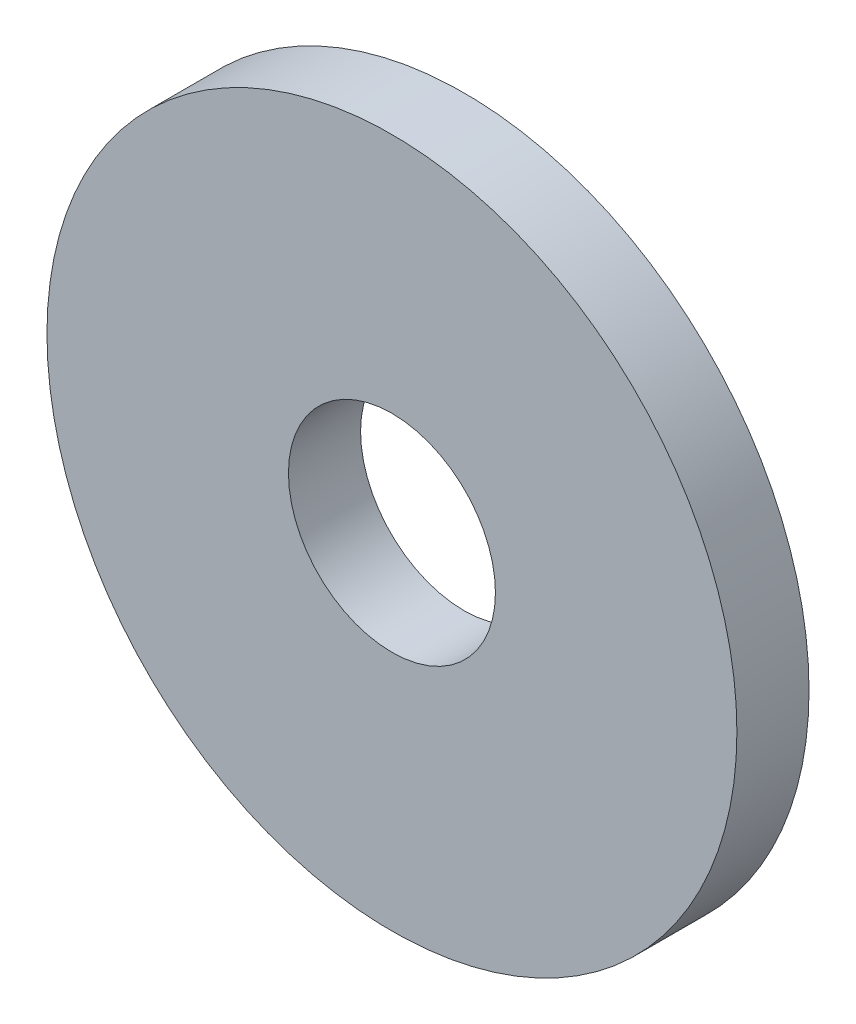
ISO-10303-21;
HEADER;
FILE_DESCRIPTION(('STEP AP214'),'2;1');
FILE_NAME('part.step','',(''),(''),'','','');
FILE_SCHEMA(('AUTOMOTIVE_DESIGN { 1 0 10303 214 1 1 1 1 }'));
ENDSEC;
DATA;
#1=APPLICATION_CONTEXT('core data for automotive mechanical design processes');
#2=APPLICATION_PROTOCOL_DEFINITION('international standard','automotive_design',2000,#1);
#3=PRODUCT_CONTEXT('',#1,'mechanical');
#4=PRODUCT('Part','Part','',(#3));
#5=PRODUCT_RELATED_PRODUCT_CATEGORY('part','',(#4));
#6=PRODUCT_DEFINITION_FORMATION('','',#4);
#7=PRODUCT_DEFINITION_CONTEXT('part definition',#1,'design');
#8=PRODUCT_DEFINITION('design','',#6,#7);
#9=PRODUCT_DEFINITION_SHAPE('','',#8);
#10=(LENGTH_UNIT() NAMED_UNIT(*) SI_UNIT(.MILLI.,.METRE.));
#11=(NAMED_UNIT(*) PLANE_ANGLE_UNIT() SI_UNIT($,.RADIAN.));
#12=(NAMED_UNIT(*) SI_UNIT($,.STERADIAN.) SOLID_ANGLE_UNIT());
#13=UNCERTAINTY_MEASURE_WITH_UNIT(LENGTH_MEASURE(1.E-05),#10,'distance_accuracy_value','');
#14=(GEOMETRIC_REPRESENTATION_CONTEXT(3) GLOBAL_UNCERTAINTY_ASSIGNED_CONTEXT((#13)) GLOBAL_UNIT_ASSIGNED_CONTEXT((#10,
#11,#12)) REPRESENTATION_CONTEXT('',''));
#15=CARTESIAN_POINT('',(0.,0.,0.));
#16=DIRECTION('',(0.,0.,1.));
#17=DIRECTION('',(1.,0.,0.));
#18=AXIS2_PLACEMENT_3D('',#15,#16,#17);
#19=CARTESIAN_POINT('',(0.,0.,2.3));
#20=DIRECTION('',(0.,0.,1.));
#21=DIRECTION('',(1.,0.,0.));
#22=AXIS2_PLACEMENT_3D('',#19,#20,#21);
#23=PLANE('',#22);
#24=CARTESIAN_POINT('',(0.,0.,2.3));
#25=DIRECTION('',(0.,0.,1.));
#26=DIRECTION('',(1.,0.,0.));
#27=AXIS2_PLACEMENT_3D('',#24,#25,#26);
#28=CIRCLE('',#27,11.);
#29=CARTESIAN_POINT('',(11.,0.,2.3));
#30=VERTEX_POINT('',#29);
#31=EDGE_CURVE('E10',#30,#30,#28,.T.);
#32=ORIENTED_EDGE('',*,*,#31,.T.);
#33=EDGE_LOOP('',(#32));
#34=FACE_BOUND('',#33,.T.);
#35=CARTESIAN_POINT('',(0.,0.,2.3));
#36=DIRECTION('',(0.,0.,1.));
#37=DIRECTION('',(1.,0.,0.));
#38=AXIS2_PLACEMENT_3D('',#35,#36,#37);
#39=CIRCLE('',#38,3.3);
#40=CARTESIAN_POINT('',(3.3,0.,2.3));
#41=VERTEX_POINT('',#40);
#42=EDGE_CURVE('E41',#41,#41,#39,.T.);
#43=ORIENTED_EDGE('',*,*,#42,.F.);
#44=EDGE_LOOP('',(#43));
#45=FACE_BOUND('',#44,.T.);
#46=ADVANCED_FACE('F30',(#34,#45),#23,.T.);
#47=CARTESIAN_POINT('',(0.,0.,0.));
#48=DIRECTION('',(0.,0.,1.));
#49=DIRECTION('',(1.,0.,0.));
#50=AXIS2_PLACEMENT_3D('',#47,#48,#49);
#51=PLANE('',#50);
#52=CARTESIAN_POINT('',(0.,0.,0.));
#53=DIRECTION('',(0.,0.,1.));
#54=DIRECTION('',(1.,0.,0.));
#55=AXIS2_PLACEMENT_3D('',#52,#53,#54);
#56=CIRCLE('',#55,11.);
#57=CARTESIAN_POINT('',(11.,0.,0.));
#58=VERTEX_POINT('',#57);
#59=EDGE_CURVE('E34',#58,#58,#56,.T.);
#60=ORIENTED_EDGE('',*,*,#59,.F.);
#61=EDGE_LOOP('',(#60));
#62=FACE_BOUND('',#61,.T.);
#63=CARTESIAN_POINT('',(0.,0.,0.));
#64=DIRECTION('',(0.,0.,1.));
#65=DIRECTION('',(1.,0.,0.));
#66=AXIS2_PLACEMENT_3D('',#63,#64,#65);
#67=CIRCLE('',#66,3.3);
#68=CARTESIAN_POINT('',(3.3,0.,0.));
#69=VERTEX_POINT('',#68);
#70=EDGE_CURVE('E43',#69,#69,#67,.T.);
#71=ORIENTED_EDGE('',*,*,#70,.T.);
#72=EDGE_LOOP('',(#71));
#73=FACE_BOUND('',#72,.T.);
#74=ADVANCED_FACE('F53',(#62,#73),#51,.F.);
#75=CARTESIAN_POINT('',(0.,0.,2.3));
#76=DIRECTION('',(0.,0.,-1.));
#77=DIRECTION('',(-1.,0.,0.));
#78=AXIS2_PLACEMENT_3D('',#75,#76,#77);
#79=CYLINDRICAL_SURFACE('',#78,11.);
#80=ORIENTED_EDGE('',*,*,#31,.F.);
#81=EDGE_LOOP('',(#80));
#82=FACE_BOUND('',#81,.T.);
#83=ORIENTED_EDGE('',*,*,#59,.T.);
#84=EDGE_LOOP('',(#83));
#85=FACE_BOUND('',#84,.T.);
#86=ADVANCED_FACE('F32',(#82,#85),#79,.T.);
#87=CARTESIAN_POINT('',(0.,0.,2.3));
#88=DIRECTION('',(0.,0.,-1.));
#89=DIRECTION('',(-1.,0.,0.));
#90=AXIS2_PLACEMENT_3D('',#87,#88,#89);
#91=CYLINDRICAL_SURFACE('',#90,3.3);
#92=ORIENTED_EDGE('',*,*,#42,.T.);
#93=EDGE_LOOP('',(#92));
#94=FACE_BOUND('',#93,.T.);
#95=ORIENTED_EDGE('',*,*,#70,.F.);
#96=EDGE_LOOP('',(#95));
#97=FACE_BOUND('',#96,.T.);
#98=ADVANCED_FACE('F49',(#94,#97),#91,.F.);
#99=CLOSED_SHELL('',(#46,#74,#86,#98));
#100=MANIFOLD_SOLID_BREP('B2',#99);
#101=ADVANCED_BREP_SHAPE_REPRESENTATION('',(#18,#100),#14);
#102=SHAPE_DEFINITION_REPRESENTATION(#9,#101);
ENDSEC;
END-ISO-10303-21;
